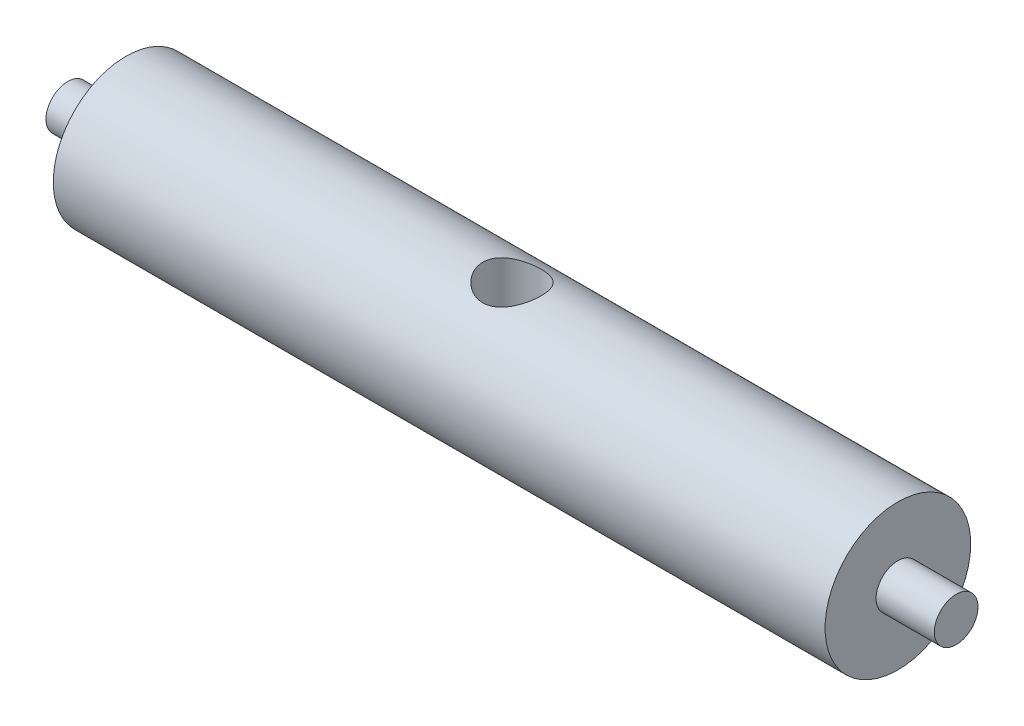
ISO-10303-21;
HEADER;
FILE_DESCRIPTION(('STEP AP214'),'2;1');
FILE_NAME('part.step','',(''),(''),'','','');
FILE_SCHEMA(('AUTOMOTIVE_DESIGN { 1 0 10303 214 1 1 1 1 }'));
ENDSEC;
DATA;
#1=APPLICATION_CONTEXT('core data for automotive mechanical design processes');
#2=APPLICATION_PROTOCOL_DEFINITION('international standard','automotive_design',2000,#1);
#3=PRODUCT_CONTEXT('',#1,'mechanical');
#4=PRODUCT('Part','Part','',(#3));
#5=PRODUCT_RELATED_PRODUCT_CATEGORY('part','',(#4));
#6=PRODUCT_DEFINITION_FORMATION('','',#4);
#7=PRODUCT_DEFINITION_CONTEXT('part definition',#1,'design');
#8=PRODUCT_DEFINITION('design','',#6,#7);
#9=PRODUCT_DEFINITION_SHAPE('','',#8);
#10=(LENGTH_UNIT() NAMED_UNIT(*) SI_UNIT(.MILLI.,.METRE.));
#11=(NAMED_UNIT(*) PLANE_ANGLE_UNIT() SI_UNIT($,.RADIAN.));
#12=(NAMED_UNIT(*) SI_UNIT($,.STERADIAN.) SOLID_ANGLE_UNIT());
#13=UNCERTAINTY_MEASURE_WITH_UNIT(LENGTH_MEASURE(1.E-05),#10,'distance_accuracy_value','');
#14=(GEOMETRIC_REPRESENTATION_CONTEXT(3) GLOBAL_UNCERTAINTY_ASSIGNED_CONTEXT((#13)) GLOBAL_UNIT_ASSIGNED_CONTEXT((#10,
#11,#12)) REPRESENTATION_CONTEXT('',''));
#15=CARTESIAN_POINT('',(0.,0.,0.));
#16=DIRECTION('',(0.,0.,1.));
#17=DIRECTION('',(1.,0.,0.));
#18=AXIS2_PLACEMENT_3D('',#15,#16,#17);
#19=CARTESIAN_POINT('',(161.329886564259,0.,0.));
#20=DIRECTION('',(-1.,0.,0.));
#21=DIRECTION('',(0.,0.,1.));
#22=AXIS2_PLACEMENT_3D('',#19,#20,#21);
#23=PLANE('',#22);
#24=CARTESIAN_POINT('',(161.329886564259,0.,0.));
#25=DIRECTION('',(1.,0.,0.));
#26=DIRECTION('',(0.,0.,-1.));
#27=AXIS2_PLACEMENT_3D('',#24,#25,#26);
#28=CIRCLE('',#27,7.5);
#29=CARTESIAN_POINT('',(161.329886564259,0.,-7.5));
#30=VERTEX_POINT('',#29);
#31=EDGE_CURVE('E53',#30,#30,#28,.T.);
#32=ORIENTED_EDGE('',*,*,#31,.T.);
#33=EDGE_LOOP('',(#32));
#34=FACE_BOUND('',#33,.T.);
#35=ADVANCED_FACE('F39',(#34),#23,.F.);
#36=CARTESIAN_POINT('',(170.,0.,0.));
#37=DIRECTION('',(1.,0.,0.));
#38=DIRECTION('',(0.,0.,-1.));
#39=AXIS2_PLACEMENT_3D('',#36,#37,#38);
#40=CYLINDRICAL_SURFACE('',#39,7.5);
#41=ORIENTED_EDGE('',*,*,#31,.F.);
#42=EDGE_LOOP('',(#41));
#43=FACE_BOUND('',#42,.T.);
#44=CARTESIAN_POINT('',(141.329886564259,0.,0.));
#45=DIRECTION('',(1.,0.,0.));
#46=DIRECTION('',(0.,0.,-1.));
#47=AXIS2_PLACEMENT_3D('',#44,#45,#46);
#48=CIRCLE('',#47,7.5);
#49=CARTESIAN_POINT('',(141.329886564259,0.,-7.5));
#50=VERTEX_POINT('',#49);
#51=EDGE_CURVE('E59',#50,#50,#48,.T.);
#52=ORIENTED_EDGE('',*,*,#51,.T.);
#53=EDGE_LOOP('',(#52));
#54=FACE_BOUND('',#53,.T.);
#55=ADVANCED_FACE('F95',(#43,#54),#40,.T.);
#56=CARTESIAN_POINT('',(141.329886564259,0.,7.5));
#57=DIRECTION('',(-1.,0.,0.));
#58=DIRECTION('',(0.,0.,1.));
#59=AXIS2_PLACEMENT_3D('',#56,#57,#58);
#60=PLANE('',#59);
#61=ORIENTED_EDGE('',*,*,#51,.F.);
#62=EDGE_LOOP('',(#61));
#63=FACE_BOUND('',#62,.T.);
#64=CARTESIAN_POINT('',(141.329886564259,0.,0.));
#65=DIRECTION('',(1.,0.,0.));
#66=DIRECTION('',(0.,0.,-1.));
#67=AXIS2_PLACEMENT_3D('',#64,#65,#66);
#68=CIRCLE('',#67,25.);
#69=CARTESIAN_POINT('',(141.329886564259,0.,-25.));
#70=VERTEX_POINT('',#69);
#71=EDGE_CURVE('E103',#70,#70,#68,.T.);
#72=ORIENTED_EDGE('',*,*,#71,.T.);
#73=EDGE_LOOP('',(#72));
#74=FACE_BOUND('',#73,.T.);
#75=ADVANCED_FACE('F86',(#63,#74),#60,.F.);
#76=CARTESIAN_POINT('',(170.,0.,0.));
#77=DIRECTION('',(1.,0.,0.));
#78=DIRECTION('',(0.,0.,-1.));
#79=AXIS2_PLACEMENT_3D('',#76,#77,#78);
#80=CYLINDRICAL_SURFACE('',#79,25.);
#81=CARTESIAN_POINT('',(18.8298865642593,-25.,0.));
#82=CARTESIAN_POINT('',(18.8298850245841,-24.9999987997865,-0.268856074860531));
#83=CARTESIAN_POINT('',(18.8190290647676,-24.9956509062151,-0.537815867184061));
#84=CARTESIAN_POINT('',(18.7757030297661,-24.9783682336247,-1.07383269974277));
#85=CARTESIAN_POINT('',(18.7432185187103,-24.9654277195188,-1.3408883486629));
#86=CARTESIAN_POINT('',(18.6568618924264,-24.9312628694214,-1.87162915698771));
#87=CARTESIAN_POINT('',(18.6029403033022,-24.9100193731908,-2.13530505305288));
#88=CARTESIAN_POINT('',(18.4742473597823,-24.8598107170243,-2.6567730759769));
#89=CARTESIAN_POINT('',(18.3994745818125,-24.8308450298769,-2.91456479980492));
#90=CARTESIAN_POINT('',(18.2300703657999,-24.7660524816575,-3.42166104430993));
#91=CARTESIAN_POINT('',(18.1355067627588,-24.7302490932326,-3.6709912597387));
#92=CARTESIAN_POINT('',(17.927184494198,-24.6526163121148,-4.16052228229908));
#93=CARTESIAN_POINT('',(17.8134250948598,-24.6107866890596,-4.40072273998723));
#94=CARTESIAN_POINT('',(17.5676671067677,-24.5221467640575,-4.87046113042968));
#95=CARTESIAN_POINT('',(17.4356796014,-24.4753394926589,-5.10000543006426));
#96=CARTESIAN_POINT('',(17.1543457026112,-24.3778429906047,-5.54736801749604));
#97=CARTESIAN_POINT('',(17.0049929685593,-24.3271523443168,-5.76518197940768));
#98=CARTESIAN_POINT('',(16.5188881791798,-24.1665964736247,-6.4172438379209));
#99=CARTESIAN_POINT('',(16.1544724060022,-24.0521426641821,-6.83020129935837));
#100=CARTESIAN_POINT('',(15.3627673658317,-23.8230010140197,-7.59098514099718));
#101=CARTESIAN_POINT('',(14.9354475202491,-23.7083130863822,-7.93877965659416));
#102=CARTESIAN_POINT('',(14.2446794251232,-23.5428728598154,-8.41206275515425));
#103=CARTESIAN_POINT('',(14.0003281238631,-23.4877248195698,-8.5644417390942));
#104=CARTESIAN_POINT('',(13.4986129756213,-23.3824066748428,-8.84793241589348));
#105=CARTESIAN_POINT('',(13.2412545345469,-23.3322345275956,-8.97905285022916));
#106=CARTESIAN_POINT('',(12.7151932018575,-23.2385160540364,-9.21889182633416));
#107=CARTESIAN_POINT('',(12.4464920132899,-23.1949687375331,-9.32761371680114));
#108=CARTESIAN_POINT('',(11.8995896577569,-23.1160096793165,-9.52161114995809));
#109=CARTESIAN_POINT('',(11.6213891372521,-23.0805973852509,-9.60688828457942));
#110=CARTESIAN_POINT('',(11.0704111783322,-23.0206079838299,-9.74973528539365));
#111=CARTESIAN_POINT('',(10.7979593975865,-22.9956125457123,-9.80838572943902));
#112=CARTESIAN_POINT('',(10.2484166612079,-22.9551119253165,-9.90280197179768));
#113=CARTESIAN_POINT('',(9.97132583929974,-22.9396064699632,-9.93856842860118));
#114=CARTESIAN_POINT('',(9.41485999769149,-22.9186588790925,-9.98677972827227));
#115=CARTESIAN_POINT('',(9.13548599381073,-22.9132124894693,-9.99923443000528));
#116=CARTESIAN_POINT('',(8.57667140616275,-22.9125744009913,-10.0006969671016));
#117=CARTESIAN_POINT('',(8.2972308261087,-22.9173822238512,-9.98970589604163));
#118=CARTESIAN_POINT('',(7.76008054854313,-22.9363800146668,-9.94600313749438));
#119=CARTESIAN_POINT('',(7.50221699643529,-22.9498908045519,-9.91486313456687));
#120=CARTESIAN_POINT('',(6.9901562068611,-22.9851984225197,-9.8327336235158));
#121=CARTESIAN_POINT('',(6.73596026988048,-23.0069981182585,-9.781737245671));
#122=CARTESIAN_POINT('',(6.23308769954878,-23.0582046113723,-9.66041020472596));
#123=CARTESIAN_POINT('',(5.98440968997369,-23.0876094882508,-9.59008442249782));
#124=CARTESIAN_POINT('',(5.49395029802248,-23.1531719541529,-9.43069714925148));
#125=CARTESIAN_POINT('',(5.25217165197472,-23.1893321806322,-9.34162833876785));
#126=CARTESIAN_POINT('',(4.77224957300824,-23.2681599648486,-9.14353943713228));
#127=CARTESIAN_POINT('',(4.53427493151306,-23.3109429673933,-9.03415671764844));
#128=CARTESIAN_POINT('',(4.06824952748161,-23.4013011816823,-8.79745135779796));
#129=CARTESIAN_POINT('',(3.84020313526407,-23.4488784738847,-8.67012091946703));
#130=CARTESIAN_POINT('',(3.39529289494825,-23.5475634448723,-8.3984011893299));
#131=CARTESIAN_POINT('',(3.17843000828985,-23.5986714263082,-8.25401043435778));
#132=CARTESIAN_POINT('',(2.75696750804066,-23.7031359757158,-7.94904534241154));
#133=CARTESIAN_POINT('',(2.55236852804223,-23.7564926596206,-7.78847017044628));
#134=CARTESIAN_POINT('',(2.14107130265659,-23.8683493888784,-7.4389592226215));
#135=CARTESIAN_POINT('',(1.93544101609114,-23.9269273831722,-7.24878974667802));
#136=CARTESIAN_POINT('',(1.54084819500534,-24.0435970671542,-6.85187633581007));
#137=CARTESIAN_POINT('',(1.35188031890494,-24.1016889072473,-6.64513775342319));
#138=CARTESIAN_POINT('',(0.99159215245491,-24.2158965644374,-6.21608047044623));
#139=CARTESIAN_POINT('',(0.820282343380405,-24.2720111950678,-5.99375264661732));
#140=CARTESIAN_POINT('',(0.49666317561181,-24.3807175493342,-5.53499341439676));
#141=CARTESIAN_POINT('',(0.344346198615422,-24.4333106815495,-5.29856771748542));
#142=CARTESIAN_POINT('',(0.0569179699890909,-24.5345984437363,-4.80805882216912));
#143=CARTESIAN_POINT('',(-0.0777870199914073,-24.5831937519816,-4.55371661527417));
#144=CARTESIAN_POINT('',(-0.32514915601013,-24.6739018528091,-4.03339771843727));
#145=CARTESIAN_POINT('',(-0.437805806257759,-24.7160144996142,-3.76742076703483));
#146=CARTESIAN_POINT('',(-0.639933038531597,-24.7925136047952,-3.22583634859035));
#147=CARTESIAN_POINT('',(-0.729413137974608,-24.8269032338432,-2.95023288759322));
#148=CARTESIAN_POINT('',(-0.884288220477059,-24.8869461323192,-2.39141303874016));
#149=CARTESIAN_POINT('',(-0.949684871119455,-24.912600006618,-2.10819717943852));
#150=CARTESIAN_POINT('',(-1.05250901766527,-24.9531491378345,-1.55340742666084));
#151=CARTESIAN_POINT('',(-1.09136347905876,-24.9685915436087,-1.28213731335237));
#152=CARTESIAN_POINT('',(-1.14668268604855,-24.9906239490529,-0.736968270557567));
#153=CARTESIAN_POINT('',(-1.16314831495402,-24.9972142979641,-0.463069445211492));
#154=CARTESIAN_POINT('',(-1.17350784605886,-25.0013575249535,0.0851598379811589));
#155=CARTESIAN_POINT('',(-1.16740683806065,-24.9989124409328,0.359490184549183));
#156=CARTESIAN_POINT('',(-1.13271200085134,-24.9850578630712,0.906492693951385));
#157=CARTESIAN_POINT('',(-1.10411860289345,-24.9736485411043,1.17916488847679));
#158=CARTESIAN_POINT('',(-1.02654204222242,-24.9428944617283,1.70854732386813));
#159=CARTESIAN_POINT('',(-0.978534683608005,-24.923930044487,1.96542355576027));
#160=CARTESIAN_POINT('',(-0.862756337023854,-24.8785950215099,2.47400175061255));
#161=CARTESIAN_POINT('',(-0.794986093249282,-24.8522246946539,2.72570390802669));
#162=CARTESIAN_POINT('',(-0.640299607247092,-24.7927274324882,3.22229813642293));
#163=CARTESIAN_POINT('',(-0.553385196956124,-24.7596011436901,3.46719085648766));
#164=CARTESIAN_POINT('',(-0.361097604222574,-24.6873702837333,3.9488064919336));
#165=CARTESIAN_POINT('',(-0.255717369457729,-24.6482634292529,4.18552624446408));
#166=CARTESIAN_POINT('',(-0.0238755842230377,-24.5637355669625,4.65637431549393));
#167=CARTESIAN_POINT('',(0.103126387570196,-24.5181595718834,4.89020861642284));
#168=CARTESIAN_POINT('',(0.374956268632489,-24.4227281140638,5.34646626010515));
#169=CARTESIAN_POINT('',(0.519790773226031,-24.3728710700618,5.5688853376114));
#170=CARTESIAN_POINT('',(0.826312116499516,-24.2700712408648,6.00108282759734));
#171=CARTESIAN_POINT('',(0.988001566615144,-24.2171279780655,6.21085927331032));
#172=CARTESIAN_POINT('',(1.32724425976898,-24.1094125367316,6.61666901060691));
#173=CARTESIAN_POINT('',(1.50479819412834,-24.0546402785608,6.81270170261876));
#174=CARTESIAN_POINT('',(1.88706605798678,-23.9409125069598,7.20254295137973));
#175=CARTESIAN_POINT('',(2.09280029778359,-23.8819204692508,7.39534176566787));
#176=CARTESIAN_POINT('',(2.5198836078278,-23.7649738385416,7.76293857281914));
#177=CARTESIAN_POINT('',(2.74122619810315,-23.7070188273924,7.93774396256411));
#178=CARTESIAN_POINT('',(3.19848267251339,-23.593720133858,8.26843059588892));
#179=CARTESIAN_POINT('',(3.43440558099418,-23.538378106896,8.42429993857329));
#180=CARTESIAN_POINT('',(3.91922507370743,-23.4320016304818,8.71581171003194));
#181=CARTESIAN_POINT('',(4.16811606324234,-23.3809653479294,8.85146276546174));
#182=CARTESIAN_POINT('',(4.68006089618933,-23.2842703305124,9.10280639879049));
#183=CARTESIAN_POINT('',(4.94323360028522,-23.238671964528,9.21828055041374));
#184=CARTESIAN_POINT('',(5.47948375985036,-23.1550234711654,9.42642443062141));
#185=CARTESIAN_POINT('',(5.75255665653511,-23.1169699205255,9.51910450602977));
#186=CARTESIAN_POINT('',(6.30660812395344,-23.0497585085388,9.68071804908998));
#187=CARTESIAN_POINT('',(6.58758361876337,-23.0205972369911,9.74966062141868));
#188=CARTESIAN_POINT('',(7.15527706891076,-22.9722522407198,9.86303416879319));
#189=CARTESIAN_POINT('',(7.44199454142817,-22.9530676807219,9.90746719585546));
#190=CARTESIAN_POINT('',(7.99793579855223,-22.9264187578509,9.96896941516584));
#191=CARTESIAN_POINT('',(8.26693268458748,-22.9182099556266,9.98777855145424));
#192=CARTESIAN_POINT('',(8.80568300950233,-22.9113084125327,10.0036007443374));
#193=CARTESIAN_POINT('',(9.07543640981079,-22.9126151950183,10.0006148926641));
#194=CARTESIAN_POINT('',(9.61357191448285,-22.924698481609,9.97288442296758));
#195=CARTESIAN_POINT('',(9.8819541763026,-22.9354738726189,9.94814236252482));
#196=CARTESIAN_POINT('',(10.4153329210268,-22.9661217417621,9.87718285711175));
#197=CARTESIAN_POINT('',(10.6803294194998,-22.9859941780495,9.83096551092646));
#198=CARTESIAN_POINT('',(11.1945421313729,-23.0332077771448,9.71981602540456));
#199=CARTESIAN_POINT('',(11.4439664535528,-23.0602198972277,9.65570270870785));
#200=CARTESIAN_POINT('',(11.9364327037834,-23.1212218533426,9.50870278292123));
#201=CARTESIAN_POINT('',(12.1794723816125,-23.1552141132257,9.42580965151138));
#202=CARTESIAN_POINT('',(12.6576621191681,-23.2292069389726,9.24195624947851));
#203=CARTESIAN_POINT('',(12.8928122132842,-23.2692074786428,9.14099605761938));
#204=CARTESIAN_POINT('',(13.3539807532986,-23.354144070811,8.92175817041255));
#205=CARTESIAN_POINT('',(13.5799984085377,-23.3990805494008,8.8034789797194));
#206=CARTESIAN_POINT('',(14.0344063498921,-23.4954237957677,8.54314954404244));
#207=CARTESIAN_POINT('',(14.2621921269624,-23.5470536803879,8.40012626727163));
#208=CARTESIAN_POINT('',(14.7050713061819,-23.6531511601589,8.09656015792464));
#209=CARTESIAN_POINT('',(14.9201643183813,-23.7076188423965,7.93601678752372));
#210=CARTESIAN_POINT('',(15.336598205934,-23.817996796352,7.59832768421346));
#211=CARTESIAN_POINT('',(15.5379354244468,-23.873907446268,7.42117756602611));
#212=CARTESIAN_POINT('',(15.9257334935827,-23.9857576065712,7.05129496054495));
#213=CARTESIAN_POINT('',(16.1121943012537,-24.0416971170414,6.85856242826383));
#214=CARTESIAN_POINT('',(16.4808514570382,-24.1558392130588,6.44548479688065));
#215=CARTESIAN_POINT('',(16.6619786393565,-24.2139518191812,6.22415880544766));
#216=CARTESIAN_POINT('',(17.0048968423733,-24.3270342209604,5.76636554767971));
#217=CARTESIAN_POINT('',(17.166694309843,-24.3820050612383,5.52990337014265));
#218=CARTESIAN_POINT('',(17.4699213234907,-24.4873430159981,5.04302520254519));
#219=CARTESIAN_POINT('',(17.6113358006401,-24.5377067144988,4.7925990767804));
#220=CARTESIAN_POINT('',(17.8724518136051,-24.6323603221543,4.27958410118838));
#221=CARTESIAN_POINT('',(17.9921551685882,-24.6766507401113,4.01699627270265));
#222=CARTESIAN_POINT('',(18.206732878117,-24.757131014986,3.48641938956063));
#223=CARTESIAN_POINT('',(18.3020255549038,-24.7934555593819,3.21862009434));
#224=CARTESIAN_POINT('',(18.4696642575631,-24.8579830838019,2.67499006156433));
#225=CARTESIAN_POINT('',(18.5420125176448,-24.8861868545606,2.39916010885091));
#226=CARTESIAN_POINT('',(18.6628245608441,-24.9335835663544,1.84235798007563));
#227=CARTESIAN_POINT('',(18.7113526973381,-24.9528007790977,1.5614018097513));
#228=CARTESIAN_POINT('',(18.7842350323072,-24.981751796346,0.996030345534966));
#229=CARTESIAN_POINT('',(18.8086075334679,-24.9914927808704,0.711617836169723));
#230=CARTESIAN_POINT('',(18.8238138858184,-24.9975715745525,0.355650704383975));
#231=CARTESIAN_POINT('',(18.8260906330447,-24.9984818374927,0.284544705449415));
#232=CARTESIAN_POINT('',(18.8291271756447,-24.9996962088899,0.142294892327657));
#233=CARTESIAN_POINT('',(18.8298869717247,-25.000000317629,0.0711510781580792));
#234=CARTESIAN_POINT('',(18.8298865642593,-25.,0.));
#235=B_SPLINE_CURVE_WITH_KNOTS('',3,(#81,#82,#83,#84,#85,#86,#87,#88,#89,#90,#91,#92,#93,#94,
#95,#96,#97,#98,#99,#100,#101,#102,#103,#104,#105,#106,#107,#108,#109,#110,#111,#112,#113,#114,
#115,#116,#117,#118,#119,#120,#121,#122,#123,#124,#125,#126,#127,#128,#129,#130,#131,#132,#133,
#134,#135,#136,#137,#138,#139,#140,#141,#142,#143,#144,#145,#146,#147,#148,#149,#150,#151,#152,
#153,#154,#155,#156,#157,#158,#159,#160,#161,#162,#163,#164,#165,#166,#167,#168,#169,#170,#171,
#172,#173,#174,#175,#176,#177,#178,#179,#180,#181,#182,#183,#184,#185,#186,#187,#188,#189,#190,
#191,#192,#193,#194,#195,#196,#197,#198,#199,#200,#201,#202,#203,#204,#205,#206,#207,#208,#209,
#210,#211,#212,#213,#214,#215,#216,#217,#218,#219,#220,#221,#222,#223,#224,#225,#226,#227,#228,
#229,#230,#231,#232,#233,#234),.UNSPECIFIED.,.T.,.F.,(4,2,2,2,2,2,2,2,2,2,2,2,2,2,2,2,2,2,2,2,2,
2,2,2,2,2,2,2,2,2,2,2,2,2,2,2,2,2,2,2,2,2,2,2,2,2,2,2,2,2,2,2,2,2,2,2,2,2,2,2,2,2,2,2,2,2,2,2,2,
2,2,2,2,2,2,2,4),(0.,0.806495090253884,1.61352901204663,2.42243637354712,3.23139897513663,
4.03763290448173,4.84389766159324,5.64967431975257,6.45574612361467,8.13547753023531,
9.81602819193602,10.694707797626,11.5730251704575,12.4512111348729,13.3293374545104,
14.1676655351282,15.0059694916428,15.8439188375795,16.6818291000581,17.4611798477732,
18.2408004678299,19.0202244062865,19.7999532895437,20.5952401365098,21.390873592699,
22.1865753354242,22.9823181512592,23.8397788259253,24.6969636116696,25.5546543004731,
26.4119998426968,27.2865371874541,28.1610941952603,29.0352914960723,29.9094282544451,
30.7317995525055,31.5541384045154,32.3762917930447,33.1984294185694,33.983557852985,
34.7686567262637,35.5536805047584,36.3390047493958,37.148039200339,37.9573737748828,
38.7668339312861,39.5763293784743,40.4395111060201,41.3023365607017,42.1657015075946,
43.028697016395,43.9005230484902,44.7719526026287,45.6430475408588,46.5140695371977,
47.3223742627689,48.1306384998533,48.9388077330427,49.7469732487393,50.5229462159874,
51.299189096643,52.0754285933276,52.8517351511297,53.6724705660738,54.4932311827125,
55.3142091481697,56.1351894839203,57.0096537898216,57.8838256287516,58.7586404591003,
59.6333819551212,60.4919426970582,61.35041981108,62.2065646863994,63.0620603650732,
63.2754943443634,63.4889282242954),.UNSPECIFIED.);
#236=CARTESIAN_POINT('',(18.8298865642593,-25.,0.));
#237=VERTEX_POINT('',#236);
#238=EDGE_CURVE('E10',#237,#237,#235,.T.);
#239=ORIENTED_EDGE('',*,*,#238,.T.);
#240=EDGE_LOOP('',(#239));
#241=FACE_BOUND('',#240,.T.);
#242=CARTESIAN_POINT('',(8.82988656425929,22.9128784747792,10.));
#243=CARTESIAN_POINT('',(8.56194326456847,22.9128805408451,9.99999793321158));
#244=CARTESIAN_POINT('',(8.29391810552582,22.9175942500596,9.98921628888234));
#245=CARTESIAN_POINT('',(7.75980513734415,22.9362975822814,9.94619451282887));
#246=CARTESIAN_POINT('',(7.49371861480682,22.9502928826588,9.9139412472822));
#247=CARTESIAN_POINT('',(6.96500636487497,22.9871287793724,9.82822912582097));
#248=CARTESIAN_POINT('',(6.70238939105505,23.0099884863473,9.77472444822009));
#249=CARTESIAN_POINT('',(6.18306463574111,23.0638014913945,9.64706427262734));
#250=CARTESIAN_POINT('',(5.92635731750477,23.0947554216379,9.57290716161962));
#251=CARTESIAN_POINT('',(5.42154041187332,23.1636467363272,9.40498076098217));
#252=CARTESIAN_POINT('',(5.17340134267634,23.2015565729952,9.31128864382296));
#253=CARTESIAN_POINT('',(4.68616788664925,23.2833138782598,9.10492212636566));
#254=CARTESIAN_POINT('',(4.44707380545784,23.3271615472725,8.99224708531698));
#255=CARTESIAN_POINT('',(3.97936128041984,23.4195445548277,8.74882020570514));
#256=CARTESIAN_POINT('',(3.75073787427675,23.468077638228,8.61807705058089));
#257=CARTESIAN_POINT('',(3.30500332518884,23.5685622621145,8.33935515193117));
#258=CARTESIAN_POINT('',(3.087896436809,23.6205150502817,8.19137010235739));
#259=CARTESIAN_POINT('',(2.43384273134111,23.7849852068794,7.70678893382988));
#260=CARTESIAN_POINT('',(2.01821413523778,23.9011684270195,7.34201789012633));
#261=CARTESIAN_POINT('',(1.2521318538117,24.1306503294368,6.54842438515518));
#262=CARTESIAN_POINT('',(0.901700944173139,24.2439479918097,6.11957963482135));
#263=CARTESIAN_POINT('',(0.425605406348082,24.4050933288709,5.42687385287901));
#264=CARTESIAN_POINT('',(0.272756742393793,24.458266992319,5.18254798242876));
#265=CARTESIAN_POINT('',(-0.0116703044520334,24.5592227290752,4.68080345216479));
#266=CARTESIAN_POINT('',(-0.143257448844761,24.6070070207856,4.42339024320005));
#267=CARTESIAN_POINT('',(-0.383995572349148,24.6958115621907,3.89719145764577));
#268=CARTESIAN_POINT('',(-0.493148658536922,24.7368324470539,3.62840695194563));
#269=CARTESIAN_POINT('',(-0.687956463300829,24.8109091084033,3.08138490461891));
#270=CARTESIAN_POINT('',(-0.773612683204812,24.8439653937695,2.80314796823089));
#271=CARTESIAN_POINT('',(-0.91693878384271,24.8997281846262,2.25304981478946));
#272=CARTESIAN_POINT('',(-0.975762655614317,24.9228582219961,1.98153191139516));
#273=CARTESIAN_POINT('',(-1.07066849006699,24.9603502443495,1.43394947548978));
#274=CARTESIAN_POINT('',(-1.106751123737,24.9747124880296,1.15788507737141));
#275=CARTESIAN_POINT('',(-1.15576523722305,24.9942540664145,0.603472781279834));
#276=CARTESIAN_POINT('',(-1.16870407748576,24.9994363206366,0.325125637591999));
#277=CARTESIAN_POINT('',(-1.17130453861818,25.0004763776147,-0.231690269616354));
#278=CARTESIAN_POINT('',(-1.16096697782556,24.9963345081827,-0.510159028517065));
#279=CARTESIAN_POINT('',(-1.11837152194551,24.9793412742765,-1.04935083242227));
#280=CARTESIAN_POINT('',(-1.08737942867732,24.9669929535766,-1.31019093753995));
#281=CARTESIAN_POINT('',(-1.00508553871825,24.9344189482698,-1.82813508164227));
#282=CARTESIAN_POINT('',(-0.953784648511741,24.9141936152544,-2.08523928684811));
#283=CARTESIAN_POINT('',(-0.831360758893371,24.8663734455137,-2.59398534293472));
#284=CARTESIAN_POINT('',(-0.76023704654874,24.8387783437343,-2.84562699700255));
#285=CARTESIAN_POINT('',(-0.598805589357847,24.77689814144,-3.34183184481278));
#286=CARTESIAN_POINT('',(-0.508497302385986,24.7426128518732,-3.58639483830152));
#287=CARTESIAN_POINT('',(-0.307969153784971,24.667623206917,-4.07053573294833));
#288=CARTESIAN_POINT('',(-0.197473667146946,24.6268311351153,-4.30998577822872));
#289=CARTESIAN_POINT('',(0.0416813593229095,24.5401737748753,-4.77877806490354));
#290=CARTESIAN_POINT('',(0.17034742812744,24.494306664185,-5.00811663404913));
#291=CARTESIAN_POINT('',(0.444915956405899,24.3985896749035,-5.45537645337101));
#292=CARTESIAN_POINT('',(0.590819776071578,24.3487394821171,-5.67329680060028));
#293=CARTESIAN_POINT('',(0.898931845976873,24.2462149424079,-6.09659718709494));
#294=CARTESIAN_POINT('',(1.06114129620778,24.1935403877634,-6.30197630161438));
#295=CARTESIAN_POINT('',(1.41208612620537,24.0830694630538,-6.71221301735345));
#296=CARTESIAN_POINT('',(1.60186397411211,24.0251639209819,-6.9161504181863));
#297=CARTESIAN_POINT('',(1.99771696629605,23.9090514618511,-7.30745656576433));
#298=CARTESIAN_POINT('',(2.20379272975974,23.8508445334205,-7.49482468243987));
#299=CARTESIAN_POINT('',(2.63113774312854,23.7356723512,-7.85194731916161));
#300=CARTESIAN_POINT('',(2.85241227487765,23.6787075382205,-8.02169566403247));
#301=CARTESIAN_POINT('',(3.30884125106188,23.5676251560312,-8.34241283442462));
#302=CARTESIAN_POINT('',(3.54399508584404,23.513507461958,-8.49338248390242));
#303=CARTESIAN_POINT('',(4.0337725187494,23.4082017032714,-8.77952196622691));
#304=CARTESIAN_POINT('',(4.2887606714603,23.3571417580589,-8.91411616997539));
#305=CARTESIAN_POINT('',(4.81028758615144,23.2613739872971,-9.16111521734942));
#306=CARTESIAN_POINT('',(5.07682130793008,23.2166634256868,-9.27352962681966));
#307=CARTESIAN_POINT('',(5.61962435435312,23.135121107202,-9.47512554120231));
#308=CARTESIAN_POINT('',(5.89589069928647,23.0982869629079,-9.56431408789334));
#309=CARTESIAN_POINT('',(6.45613579455728,23.0338295541397,-9.71852350581113));
#310=CARTESIAN_POINT('',(6.74011392205976,23.0062055481958,-9.78354632256829));
#311=CARTESIAN_POINT('',(7.29592491545387,22.9626006906713,-9.88543600469156));
#312=CARTESIAN_POINT('',(7.56743976480988,22.9460115898205,-9.9237804029209));
#313=CARTESIAN_POINT('',(8.11311585918117,22.9224667142984,-9.97804609794811));
#314=CARTESIAN_POINT('',(8.38727699516987,22.9155105444435,-9.99396831459955));
#315=CARTESIAN_POINT('',(8.93597823539189,22.9114819849895,-10.003200377686));
#316=CARTESIAN_POINT('',(9.21051822012536,22.9144069800642,-9.99651620753228));
#317=CARTESIAN_POINT('',(9.75783606073364,22.9300298105342,-9.96062826175442));
#318=CARTESIAN_POINT('',(10.030613960858,22.9427273995504,-9.93142505386306));
#319=CARTESIAN_POINT('',(10.5567420555118,22.9764462222691,-9.85315233472955));
#320=CARTESIAN_POINT('',(10.8103104189347,22.9969492930814,-9.80531592526263));
#321=CARTESIAN_POINT('',(11.3123828347173,23.0456142329536,-9.69038472806973));
#322=CARTESIAN_POINT('',(11.5608850987491,23.0737787578481,-9.62328326168505));
#323=CARTESIAN_POINT('',(12.0511344948959,23.1369260407722,-9.47045293684303));
#324=CARTESIAN_POINT('',(12.2928830356719,23.1719073646605,-9.3847279960203));
#325=CARTESIAN_POINT('',(12.7683854516018,23.2477235422388,-9.19531146757514));
#326=CARTESIAN_POINT('',(13.0021361645938,23.2885606788048,-9.09161286965463));
#327=CARTESIAN_POINT('',(13.4695062375009,23.3767257569357,-8.86252494540216));
#328=CARTESIAN_POINT('',(13.7027440490438,23.4242483826544,-8.73643228058633));
#329=CARTESIAN_POINT('',(14.1579780764197,23.5231622000212,-8.46649303986494));
#330=CARTESIAN_POINT('',(14.3799692616064,23.5745550977376,-8.3226386162533));
#331=CARTESIAN_POINT('',(14.8115022601266,23.6798634028616,-8.01810592519978));
#332=CARTESIAN_POINT('',(15.0210424256289,23.7337791424744,-7.85742543864996));
#333=CARTESIAN_POINT('',(15.4265951661441,23.8427852304702,-7.52017263354356));
#334=CARTESIAN_POINT('',(15.6226072106422,23.8978756248072,-7.34359969237808));
#335=CARTESIAN_POINT('',(16.0141044043934,24.0119837921073,-6.96183884376272));
#336=CARTESIAN_POINT('',(16.2084725786584,24.0709898540173,-6.75549995846805));
#337=CARTESIAN_POINT('',(16.5791560825767,24.1871909345491,-6.32685407241112));
#338=CARTESIAN_POINT('',(16.75547759014,24.2443865682715,-6.10455258076575));
#339=CARTESIAN_POINT('',(17.0890294317016,24.3554653984334,-5.64510225746265));
#340=CARTESIAN_POINT('',(17.2462506508987,24.4093470073871,-5.40794641837472));
#341=CARTESIAN_POINT('',(17.5402511744687,24.512272302061,-4.92042054662138));
#342=CARTESIAN_POINT('',(17.6770392966468,24.5613180715403,-4.67005627747839));
#343=CARTESIAN_POINT('',(17.9291069068318,24.6532357367097,-4.15761008764836));
#344=CARTESIAN_POINT('',(18.044385456931,24.6961073631627,-3.89552765661765));
#345=CARTESIAN_POINT('',(18.2523441902593,24.7744510355347,-3.36145875104921));
#346=CARTESIAN_POINT('',(18.3450241784485,24.8099230175899,-3.08947219105583));
#347=CARTESIAN_POINT('',(18.5067891572684,24.8724119460142,-2.53774672432055));
#348=CARTESIAN_POINT('',(18.575884683785,24.8994326673624,-2.25801133975319));
#349=CARTESIAN_POINT('',(18.6897605151835,24.9442251001433,-1.69291011722584));
#350=CARTESIAN_POINT('',(18.7345424639294,24.9619974368647,-1.40754466127256));
#351=CARTESIAN_POINT('',(18.7971539171146,24.9869097440467,-0.852327041038533));
#352=CARTESIAN_POINT('',(18.8165522231834,24.9946681311648,-0.582678436747228));
#353=CARTESIAN_POINT('',(18.8334444351203,25.0014220836823,-0.0425920887379794));
#354=CARTESIAN_POINT('',(18.8309393508313,25.0004180530678,0.227845618024188));
#355=CARTESIAN_POINT('',(18.804054822278,24.9896755233896,0.767415262593968));
#356=CARTESIAN_POINT('',(18.7796784199422,24.9799382389731,1.03654737675394));
#357=CARTESIAN_POINT('',(18.7093148270185,24.9519951354287,1.5715226940813));
#358=CARTESIAN_POINT('',(18.6633277170493,24.9337893478924,1.8373659095141));
#359=CARTESIAN_POINT('',(18.5519703841868,24.8900859918907,2.35566546166351));
#360=CARTESIAN_POINT('',(18.4872448374159,24.8648318151846,2.60828137105916));
#361=CARTESIAN_POINT('',(18.3385103265529,24.8074428195129,3.10706049326991));
#362=CARTESIAN_POINT('',(18.2544945972172,24.7753055868629,3.353221408433));
#363=CARTESIAN_POINT('',(18.0679121141712,24.7049318041109,3.83747450752422));
#364=CARTESIAN_POINT('',(17.9653469353912,24.6666957718564,4.07556737442907));
#365=CARTESIAN_POINT('',(17.7424505983044,24.5850167357493,4.54236828740533));
#366=CARTESIAN_POINT('',(17.6221180473483,24.54157332378,4.77107559601667));
#367=CARTESIAN_POINT('',(17.3588483209175,24.4484634900426,5.2277440493855));
#368=CARTESIAN_POINT('',(17.2151476441653,24.3986069909102,5.45522634114634));
#369=CARTESIAN_POINT('',(16.9103020788769,24.2955251578013,5.89737222856146));
#370=CARTESIAN_POINT('',(16.7491567708624,24.2422997428276,6.11203551577375));
#371=CARTESIAN_POINT('',(16.4103700402272,24.133751813928,6.52749120760673));
#372=CARTESIAN_POINT('',(16.2327225317488,24.0784285308146,6.72827844688151));
#373=CARTESIAN_POINT('',(15.8620046986004,23.967048883029,7.11484620321664));
#374=CARTESIAN_POINT('',(15.6689342230389,23.910992511189,7.30062657342055));
#375=CARTESIAN_POINT('',(15.2559382756882,23.7960585314582,7.6672528818151));
#376=CARTESIAN_POINT('',(15.0350893956047,23.7372222957869,7.84707327911462));
#377=CARTESIAN_POINT('',(14.5785275730303,23.6219835943436,8.18744004230821));
#378=CARTESIAN_POINT('',(14.3428195976175,23.5655803257902,8.34799279739824));
#379=CARTESIAN_POINT('',(13.8577551795385,23.4568451705134,8.64881574472815));
#380=CARTESIAN_POINT('',(13.6083931314777,23.4045149775795,8.78907751955799));
#381=CARTESIAN_POINT('',(13.0976669043465,23.3056049837655,9.04809415075987));
#382=CARTESIAN_POINT('',(12.8363043988755,23.2590243843614,9.16685199474662));
#383=CARTESIAN_POINT('',(12.3272322201791,23.1770166909126,9.37213926463602));
#384=CARTESIAN_POINT('',(12.0804027392584,23.1409637590321,9.46060466880606));
#385=CARTESIAN_POINT('',(11.5797110474932,23.0759605006744,9.61807222426118));
#386=CARTESIAN_POINT('',(11.3258496796715,23.0470093268642,9.68707669763829));
#387=CARTESIAN_POINT('',(10.8133472599908,22.9971568327792,9.8048386178545));
#388=CARTESIAN_POINT('',(10.5547191286814,22.9762363766741,9.85364421714409));
#389=CARTESIAN_POINT('',(10.0339790948827,22.9430254003904,9.93072834935196));
#390=CARTESIAN_POINT('',(9.77186930467061,22.9307298712265,9.95901879690777));
#391=CARTESIAN_POINT('',(9.39601117587816,22.9195922127027,9.98460530057045));
#392=CARTESIAN_POINT('',(9.28288730771327,22.9170765795758,9.9903763331015));
#393=CARTESIAN_POINT('',(9.05647603444006,22.9137192124228,9.99807426072076));
#394=CARTESIAN_POINT('',(8.94318861795061,22.9128776011261,10.0000008739587));
#395=CARTESIAN_POINT('',(8.82988656425929,22.9128784747792,10.));
#396=B_SPLINE_CURVE_WITH_KNOTS('',3,(#242,#243,#244,#245,#246,#247,#248,#249,#250,#251,#252,
#253,#254,#255,#256,#257,#258,#259,#260,#261,#262,#263,#264,#265,#266,#267,#268,#269,#270,#271,
#272,#273,#274,#275,#276,#277,#278,#279,#280,#281,#282,#283,#284,#285,#286,#287,#288,#289,#290,
#291,#292,#293,#294,#295,#296,#297,#298,#299,#300,#301,#302,#303,#304,#305,#306,#307,#308,#309,
#310,#311,#312,#313,#314,#315,#316,#317,#318,#319,#320,#321,#322,#323,#324,#325,#326,#327,#328,
#329,#330,#331,#332,#333,#334,#335,#336,#337,#338,#339,#340,#341,#342,#343,#344,#345,#346,#347,
#348,#349,#350,#351,#352,#353,#354,#355,#356,#357,#358,#359,#360,#361,#362,#363,#364,#365,#366,
#367,#368,#369,#370,#371,#372,#373,#374,#375,#376,#377,#378,#379,#380,#381,#382,#383,#384,#385,
#386,#387,#388,#389,#390,#391,#392,#393,#394,#395),.UNSPECIFIED.,.T.,.F.,(4,2,2,2,2,2,2,2,2,2,2,
2,2,2,2,2,2,2,2,2,2,2,2,2,2,2,2,2,2,2,2,2,2,2,2,2,2,2,2,2,2,2,2,2,2,2,2,2,2,2,2,2,2,2,2,2,2,2,2,
2,2,2,2,2,2,2,2,2,2,2,2,2,2,2,2,2,4),(0.,0.803715208350471,1.60792248777794,2.41387327194109,
3.21988702089503,4.02277500055334,4.82569008636513,5.62822062880672,6.43104561553657,
8.11835508856473,9.8062528917606,10.6844970132099,11.5623782974564,12.4401770906604,
13.3179197840048,14.1531749596772,14.9884054896715,15.8233703430992,16.658305841794,
17.446273530255,18.2342060516955,19.0221669149842,19.8101500477578,20.6098280134928,
21.4097940505085,22.2098232532391,23.0099113762244,23.8625484187629,24.7152178700584,
25.5681851532743,26.4211149974654,27.2984479616473,28.1754017129098,29.0520892728635,
29.9287062373094,30.7517641579796,31.5747883123177,32.3975946473909,33.2203802391775,
33.9960599176746,34.7720088280867,35.5477946676464,36.32388377207,37.1311108029376,
37.9386957771303,38.7463873942559,39.5541106676034,40.42173174889,41.2890548172621,
42.1567901663417,43.0241499597959,43.8915475649442,44.7589526560189,45.6259697425289,
46.4929282018953,47.3032840805173,48.1136025983591,48.9238084321417,49.734011243482,
50.5191121249472,51.3044887701903,52.0897987647656,52.8751703465358,53.6952201499923,
54.5152896769751,55.3356628478229,56.1560440458278,57.0274489962349,57.8985641835334,
58.7700397100328,59.6413940663998,60.4345380121312,61.2275872792868,62.0187349383591,
62.8094227517724,63.1492555012901,63.4891131644381),.UNSPECIFIED.);
#397=CARTESIAN_POINT('',(8.82988656425929,22.9128784747792,10.));
#398=VERTEX_POINT('',#397);
#399=EDGE_CURVE('E49',#398,#398,#396,.T.);
#400=ORIENTED_EDGE('',*,*,#399,.T.);
#401=EDGE_LOOP('',(#400));
#402=FACE_BOUND('',#401,.T.);
#403=ORIENTED_EDGE('',*,*,#71,.F.);
#404=EDGE_LOOP('',(#403));
#405=FACE_BOUND('',#404,.T.);
#406=CARTESIAN_POINT('',(-123.670113435741,0.,0.));
#407=DIRECTION('',(1.,0.,0.));
#408=DIRECTION('',(0.,0.,-1.));
#409=AXIS2_PLACEMENT_3D('',#406,#407,#408);
#410=CIRCLE('',#409,25.);
#411=CARTESIAN_POINT('',(-123.670113435741,0.,-25.));
#412=VERTEX_POINT('',#411);
#413=EDGE_CURVE('E104',#412,#412,#410,.T.);
#414=ORIENTED_EDGE('',*,*,#413,.T.);
#415=EDGE_LOOP('',(#414));
#416=FACE_BOUND('',#415,.T.);
#417=ADVANCED_FACE('F61',(#241,#402,#405,#416),#80,.T.);
#418=CARTESIAN_POINT('',(-123.670113435741,0.,25.));
#419=DIRECTION('',(1.,0.,0.));
#420=DIRECTION('',(0.,0.,-1.));
#421=AXIS2_PLACEMENT_3D('',#418,#419,#420);
#422=PLANE('',#421);
#423=ORIENTED_EDGE('',*,*,#413,.F.);
#424=EDGE_LOOP('',(#423));
#425=FACE_BOUND('',#424,.T.);
#426=CARTESIAN_POINT('',(-123.670113435741,0.,0.));
#427=DIRECTION('',(1.,0.,0.));
#428=DIRECTION('',(0.,0.,-1.));
#429=AXIS2_PLACEMENT_3D('',#426,#427,#428);
#430=CIRCLE('',#429,7.5);
#431=CARTESIAN_POINT('',(-123.670113435741,0.,-7.5));
#432=VERTEX_POINT('',#431);
#433=EDGE_CURVE('E109',#432,#432,#430,.T.);
#434=ORIENTED_EDGE('',*,*,#433,.T.);
#435=EDGE_LOOP('',(#434));
#436=FACE_BOUND('',#435,.T.);
#437=ADVANCED_FACE('F78',(#425,#436),#422,.F.);
#438=CARTESIAN_POINT('',(170.,0.,0.));
#439=DIRECTION('',(1.,0.,0.));
#440=DIRECTION('',(0.,0.,-1.));
#441=AXIS2_PLACEMENT_3D('',#438,#439,#440);
#442=CYLINDRICAL_SURFACE('',#441,7.5);
#443=ORIENTED_EDGE('',*,*,#433,.F.);
#444=EDGE_LOOP('',(#443));
#445=FACE_BOUND('',#444,.T.);
#446=CARTESIAN_POINT('',(-143.670113435741,0.,0.));
#447=DIRECTION('',(1.,0.,0.));
#448=DIRECTION('',(0.,0.,-1.));
#449=AXIS2_PLACEMENT_3D('',#446,#447,#448);
#450=CIRCLE('',#449,7.5);
#451=CARTESIAN_POINT('',(-143.670113435741,0.,-7.5));
#452=VERTEX_POINT('',#451);
#453=EDGE_CURVE('E114',#452,#452,#450,.T.);
#454=ORIENTED_EDGE('',*,*,#453,.T.);
#455=EDGE_LOOP('',(#454));
#456=FACE_BOUND('',#455,.T.);
#457=ADVANCED_FACE('F80',(#445,#456),#442,.T.);
#458=CARTESIAN_POINT('',(-143.670113435741,0.,7.5));
#459=DIRECTION('',(1.,0.,0.));
#460=DIRECTION('',(0.,0.,-1.));
#461=AXIS2_PLACEMENT_3D('',#458,#459,#460);
#462=PLANE('',#461);
#463=ORIENTED_EDGE('',*,*,#453,.F.);
#464=EDGE_LOOP('',(#463));
#465=FACE_BOUND('',#464,.T.);
#466=ADVANCED_FACE('F75',(#465),#462,.F.);
#467=CARTESIAN_POINT('',(8.82988656425929,-25.,0.));
#468=DIRECTION('',(0.,1.,0.));
#469=DIRECTION('',(0.,0.,1.));
#470=AXIS2_PLACEMENT_3D('',#467,#468,#469);
#471=CYLINDRICAL_SURFACE('',#470,10.);
#472=ORIENTED_EDGE('',*,*,#399,.F.);
#473=EDGE_LOOP('',(#472));
#474=FACE_BOUND('',#473,.T.);
#475=ORIENTED_EDGE('',*,*,#238,.F.);
#476=EDGE_LOOP('',(#475));
#477=FACE_BOUND('',#476,.T.);
#478=ADVANCED_FACE('F68',(#474,#477),#471,.F.);
#479=CLOSED_SHELL('',(#35,#55,#75,#417,#437,#457,#466,#478));
#480=MANIFOLD_SOLID_BREP('B2',#479);
#481=ADVANCED_BREP_SHAPE_REPRESENTATION('',(#18,#480),#14);
#482=SHAPE_DEFINITION_REPRESENTATION(#9,#481);
ENDSEC;
END-ISO-10303-21;
